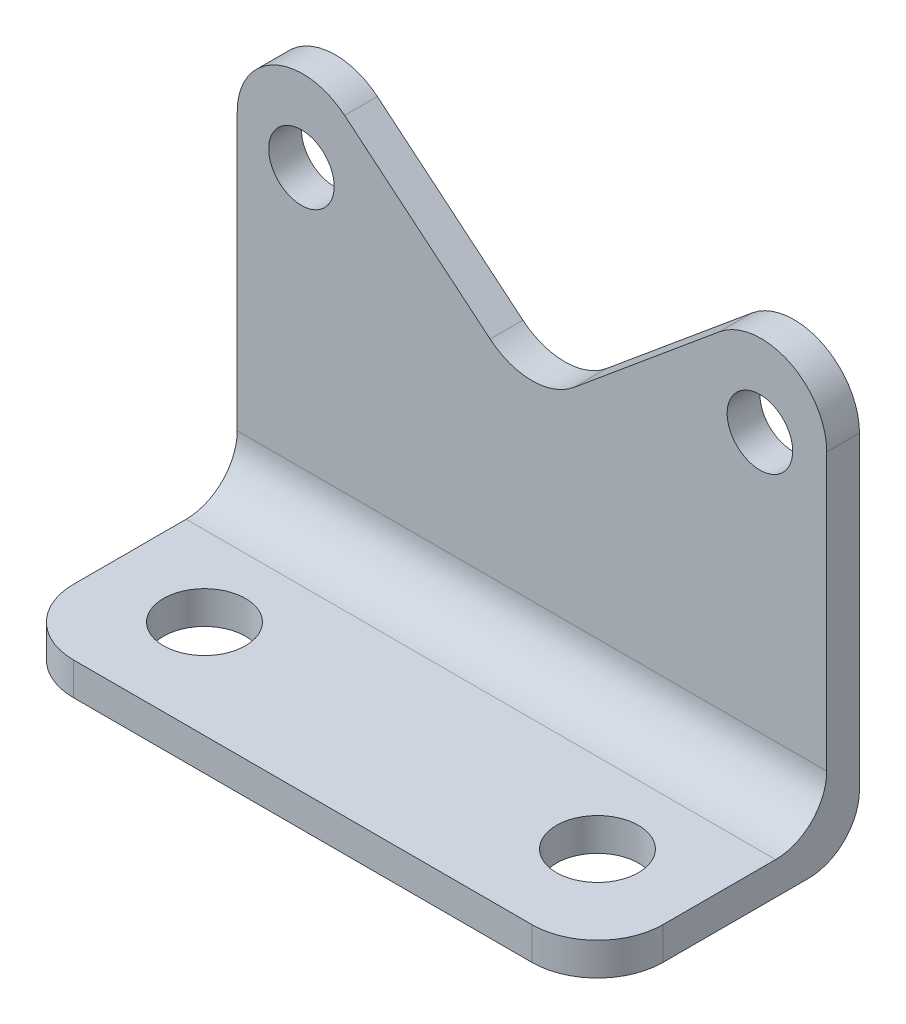
ISO-10303-21;
HEADER;
FILE_DESCRIPTION(('STEP AP214'),'2;1');
FILE_NAME('part.step','',(''),(''),'','','');
FILE_SCHEMA(('AUTOMOTIVE_DESIGN { 1 0 10303 214 1 1 1 1 }'));
ENDSEC;
DATA;
#1=APPLICATION_CONTEXT('core data for automotive mechanical design processes');
#2=APPLICATION_PROTOCOL_DEFINITION('international standard','automotive_design',2000,#1);
#3=PRODUCT_CONTEXT('',#1,'mechanical');
#4=PRODUCT('Part','Part','',(#3));
#5=PRODUCT_RELATED_PRODUCT_CATEGORY('part','',(#4));
#6=PRODUCT_DEFINITION_FORMATION('','',#4);
#7=PRODUCT_DEFINITION_CONTEXT('part definition',#1,'design');
#8=PRODUCT_DEFINITION('design','',#6,#7);
#9=PRODUCT_DEFINITION_SHAPE('','',#8);
#10=(LENGTH_UNIT() NAMED_UNIT(*) SI_UNIT(.MILLI.,.METRE.));
#11=(NAMED_UNIT(*) PLANE_ANGLE_UNIT() SI_UNIT($,.RADIAN.));
#12=(NAMED_UNIT(*) SI_UNIT($,.STERADIAN.) SOLID_ANGLE_UNIT());
#13=UNCERTAINTY_MEASURE_WITH_UNIT(LENGTH_MEASURE(1.E-05),#10,'distance_accuracy_value','');
#14=(GEOMETRIC_REPRESENTATION_CONTEXT(3) GLOBAL_UNCERTAINTY_ASSIGNED_CONTEXT((#13)) GLOBAL_UNIT_ASSIGNED_CONTEXT((#10,
#11,#12)) REPRESENTATION_CONTEXT('',''));
#15=CARTESIAN_POINT('',(0.,0.,0.));
#16=DIRECTION('',(0.,0.,1.));
#17=DIRECTION('',(1.,0.,0.));
#18=AXIS2_PLACEMENT_3D('',#15,#16,#17);
#19=CARTESIAN_POINT('',(0.,0.,3.175));
#20=DIRECTION('',(0.,0.,1.));
#21=DIRECTION('',(1.,0.,0.));
#22=AXIS2_PLACEMENT_3D('',#19,#20,#21);
#23=PLANE('',#22);
#24=CARTESIAN_POINT('',(-22.350267212,12.7,3.175));
#25=DIRECTION('',(0.,0.,1.));
#26=DIRECTION('',(1.,0.,0.));
#27=AXIS2_PLACEMENT_3D('',#24,#25,#26);
#28=CIRCLE('',#27,3.175);
#29=CARTESIAN_POINT('',(-19.175267212,12.7,3.175));
#30=VERTEX_POINT('',#29);
#31=EDGE_CURVE('E236',#30,#30,#28,.T.);
#32=ORIENTED_EDGE('',*,*,#31,.F.);
#33=EDGE_LOOP('',(#32));
#34=FACE_BOUND('',#33,.T.);
#35=CARTESIAN_POINT('',(22.099732788,12.7,3.175));
#36=DIRECTION('',(0.,0.,1.));
#37=DIRECTION('',(1.,0.,0.));
#38=AXIS2_PLACEMENT_3D('',#35,#36,#37);
#39=CIRCLE('',#38,3.175);
#40=CARTESIAN_POINT('',(25.274732788,12.7,3.175));
#41=VERTEX_POINT('',#40);
#42=EDGE_CURVE('E242',#41,#41,#39,.T.);
#43=ORIENTED_EDGE('',*,*,#42,.F.);
#44=EDGE_LOOP('',(#43));
#45=FACE_BOUND('',#44,.T.);
#46=CARTESIAN_POINT('',(-22.225,14.2875,3.175));
#47=DIRECTION('',(0.,0.,1.));
#48=DIRECTION('',(1.,0.,0.));
#49=AXIS2_PLACEMENT_3D('',#46,#47,#48);
#50=CIRCLE('',#49,6.35);
#51=CARTESIAN_POINT('',(-18.1666472309991,19.1713788685166,3.175));
#52=VERTEX_POINT('',#51);
#53=CARTESIAN_POINT('',(-28.575,14.2875,3.175));
#54=VERTEX_POINT('',#53);
#55=EDGE_CURVE('E271',#52,#54,#50,.T.);
#56=ORIENTED_EDGE('',*,*,#55,.T.);
#57=DIRECTION('',(0.,-1.,0.));
#58=VECTOR('',#57,1.);
#59=CARTESIAN_POINT('',(-28.575,20.6375,3.175));
#60=LINE('',#59,#58);
#61=CARTESIAN_POINT('',(-28.575,-12.5095,3.175));
#62=VERTEX_POINT('',#61);
#63=EDGE_CURVE('E187',#54,#62,#60,.T.);
#64=ORIENTED_EDGE('',*,*,#63,.T.);
#65=DIRECTION('',(-1.,0.,0.));
#66=VECTOR('',#65,1.);
#67=CARTESIAN_POINT('',(28.575,-12.5095,3.175));
#68=LINE('',#67,#66);
#69=CARTESIAN_POINT('',(28.575,-12.5095,3.175));
#70=VERTEX_POINT('',#69);
#71=EDGE_CURVE('E212',#62,#70,#68,.F.);
#72=ORIENTED_EDGE('',*,*,#71,.T.);
#73=DIRECTION('',(0.,1.,0.));
#74=VECTOR('',#73,1.);
#75=CARTESIAN_POINT('',(28.575,20.6375,3.175));
#76=LINE('',#75,#74);
#77=CARTESIAN_POINT('',(28.575,14.2875,3.175));
#78=VERTEX_POINT('',#77);
#79=EDGE_CURVE('E195',#70,#78,#76,.T.);
#80=ORIENTED_EDGE('',*,*,#79,.T.);
#81=CARTESIAN_POINT('',(22.225,14.2875,3.175));
#82=DIRECTION('',(0.,0.,1.));
#83=DIRECTION('',(1.,0.,0.));
#84=AXIS2_PLACEMENT_3D('',#81,#82,#83);
#85=CIRCLE('',#84,6.35);
#86=CARTESIAN_POINT('',(18.1666472309991,19.1713788685166,3.175));
#87=VERTEX_POINT('',#86);
#88=EDGE_CURVE('E493',#78,#87,#85,.T.);
#89=ORIENTED_EDGE('',*,*,#88,.T.);
#90=DIRECTION('',(0.769114782443556,0.639110672283604,0.));
#91=VECTOR('',#90,1.);
#92=CARTESIAN_POINT('',(-2.00328777681121,2.41078471922353,3.175));
#93=LINE('',#92,#91);
#94=CARTESIAN_POINT('',(4.05835276900088,7.4478211314834,3.175));
#95=VERTEX_POINT('',#94);
#96=EDGE_CURVE('E489',#95,#87,#93,.T.);
#97=ORIENTED_EDGE('',*,*,#96,.F.);
#98=CARTESIAN_POINT('',(0.,12.3317,3.175));
#99=DIRECTION('',(0.,0.,1.));
#100=DIRECTION('',(1.,0.,0.));
#101=AXIS2_PLACEMENT_3D('',#98,#99,#100);
#102=CIRCLE('',#101,6.35);
#103=CARTESIAN_POINT('',(-4.0583527690009,7.4478211314834,3.175));
#104=VERTEX_POINT('',#103);
#105=EDGE_CURVE('E483',#104,#95,#102,.T.);
#106=ORIENTED_EDGE('',*,*,#105,.F.);
#107=DIRECTION('',(0.769114782443556,-0.639110672283605,0.));
#108=VECTOR('',#107,1.);
#109=CARTESIAN_POINT('',(2.0032877768112,2.41078471922351,3.175));
#110=LINE('',#109,#108);
#111=EDGE_CURVE('E188',#52,#104,#110,.T.);
#112=ORIENTED_EDGE('',*,*,#111,.F.);
#113=EDGE_LOOP('',(#56,#64,#72,#80,#89,#97,#106,#112));
#114=FACE_BOUND('',#113,.T.);
#115=ADVANCED_FACE('F64',(#34,#45,#114),#23,.T.);
#116=CARTESIAN_POINT('',(0.,0.,0.));
#117=DIRECTION('',(0.,0.,1.));
#118=DIRECTION('',(1.,0.,0.));
#119=AXIS2_PLACEMENT_3D('',#116,#117,#118);
#120=PLANE('',#119);
#121=CARTESIAN_POINT('',(22.099732788,12.7,0.));
#122=DIRECTION('',(0.,0.,1.));
#123=DIRECTION('',(1.,0.,0.));
#124=AXIS2_PLACEMENT_3D('',#121,#122,#123);
#125=CIRCLE('',#124,3.175);
#126=CARTESIAN_POINT('',(25.274732788,12.7,0.));
#127=VERTEX_POINT('',#126);
#128=EDGE_CURVE('E234',#127,#127,#125,.T.);
#129=ORIENTED_EDGE('',*,*,#128,.T.);
#130=EDGE_LOOP('',(#129));
#131=FACE_BOUND('',#130,.T.);
#132=CARTESIAN_POINT('',(-22.350267212,12.7,0.));
#133=DIRECTION('',(0.,0.,1.));
#134=DIRECTION('',(1.,0.,0.));
#135=AXIS2_PLACEMENT_3D('',#132,#133,#134);
#136=CIRCLE('',#135,3.175);
#137=CARTESIAN_POINT('',(-19.175267212,12.7,0.));
#138=VERTEX_POINT('',#137);
#139=EDGE_CURVE('E68',#138,#138,#136,.T.);
#140=ORIENTED_EDGE('',*,*,#139,.T.);
#141=EDGE_LOOP('',(#140));
#142=FACE_BOUND('',#141,.T.);
#143=DIRECTION('',(0.,-1.,0.));
#144=VECTOR('',#143,1.);
#145=CARTESIAN_POINT('',(-28.575,20.6375,0.));
#146=LINE('',#145,#144);
#147=CARTESIAN_POINT('',(-28.575,14.2875,0.));
#148=VERTEX_POINT('',#147);
#149=CARTESIAN_POINT('',(-28.575,-15.6845,0.));
#150=VERTEX_POINT('',#149);
#151=EDGE_CURVE('E184',#148,#150,#146,.T.);
#152=ORIENTED_EDGE('',*,*,#151,.F.);
#153=CARTESIAN_POINT('',(-22.225,14.2875,0.));
#154=DIRECTION('',(0.,0.,1.));
#155=DIRECTION('',(1.,0.,0.));
#156=AXIS2_PLACEMENT_3D('',#153,#154,#155);
#157=CIRCLE('',#156,6.35);
#158=CARTESIAN_POINT('',(-18.1666472309991,19.1713788685166,0.));
#159=VERTEX_POINT('',#158);
#160=EDGE_CURVE('E168',#159,#148,#157,.T.);
#161=ORIENTED_EDGE('',*,*,#160,.F.);
#162=DIRECTION('',(0.769114782443556,-0.639110672283605,0.));
#163=VECTOR('',#162,1.);
#164=CARTESIAN_POINT('',(2.0032877768112,2.41078471922351,0.));
#165=LINE('',#164,#163);
#166=CARTESIAN_POINT('',(-4.0583527690009,7.4478211314834,0.));
#167=VERTEX_POINT('',#166);
#168=EDGE_CURVE('E499',#159,#167,#165,.T.);
#169=ORIENTED_EDGE('',*,*,#168,.T.);
#170=CARTESIAN_POINT('',(0.,12.3317,0.));
#171=DIRECTION('',(0.,0.,1.));
#172=DIRECTION('',(1.,0.,0.));
#173=AXIS2_PLACEMENT_3D('',#170,#171,#172);
#174=CIRCLE('',#173,6.35);
#175=CARTESIAN_POINT('',(4.05835276900088,7.4478211314834,0.));
#176=VERTEX_POINT('',#175);
#177=EDGE_CURVE('E522',#167,#176,#174,.T.);
#178=ORIENTED_EDGE('',*,*,#177,.T.);
#179=DIRECTION('',(0.769114782443556,0.639110672283604,0.));
#180=VECTOR('',#179,1.);
#181=CARTESIAN_POINT('',(-2.00328777681121,2.41078471922353,0.));
#182=LINE('',#181,#180);
#183=CARTESIAN_POINT('',(18.1666472309991,19.1713788685166,0.));
#184=VERTEX_POINT('',#183);
#185=EDGE_CURVE('E81',#176,#184,#182,.T.);
#186=ORIENTED_EDGE('',*,*,#185,.T.);
#187=CARTESIAN_POINT('',(22.225,14.2875,0.));
#188=DIRECTION('',(0.,0.,1.));
#189=DIRECTION('',(1.,0.,0.));
#190=AXIS2_PLACEMENT_3D('',#187,#188,#189);
#191=CIRCLE('',#190,6.35);
#192=CARTESIAN_POINT('',(28.575,14.2875,0.));
#193=VERTEX_POINT('',#192);
#194=EDGE_CURVE('E180',#193,#184,#191,.T.);
#195=ORIENTED_EDGE('',*,*,#194,.F.);
#196=DIRECTION('',(0.,1.,0.));
#197=VECTOR('',#196,1.);
#198=CARTESIAN_POINT('',(28.575,20.6375,0.));
#199=LINE('',#198,#197);
#200=CARTESIAN_POINT('',(28.575,-15.6845,0.));
#201=VERTEX_POINT('',#200);
#202=EDGE_CURVE('E196',#201,#193,#199,.T.);
#203=ORIENTED_EDGE('',*,*,#202,.F.);
#204=DIRECTION('',(-1.,0.,0.));
#205=VECTOR('',#204,1.);
#206=CARTESIAN_POINT('',(122.240863287072,-15.6845,0.));
#207=LINE('',#206,#205);
#208=EDGE_CURVE('E194',#201,#150,#207,.T.);
#209=ORIENTED_EDGE('',*,*,#208,.T.);
#210=EDGE_LOOP('',(#152,#161,#169,#178,#186,#195,#203,#209));
#211=FACE_BOUND('',#210,.T.);
#212=ADVANCED_FACE('F192',(#131,#142,#211),#120,.F.);
#213=CARTESIAN_POINT('',(-28.575,20.6375,3.175));
#214=DIRECTION('',(1.,0.,0.));
#215=DIRECTION('',(0.,1.,0.));
#216=AXIS2_PLACEMENT_3D('',#213,#214,#215);
#217=PLANE('',#216);
#218=DIRECTION('',(0.,0.,1.));
#219=VECTOR('',#218,1.);
#220=CARTESIAN_POINT('',(-28.575,14.2875,0.));
#221=LINE('',#220,#219);
#222=EDGE_CURVE('E172',#148,#54,#221,.T.);
#223=ORIENTED_EDGE('',*,*,#222,.F.);
#224=ORIENTED_EDGE('',*,*,#151,.T.);
#225=CARTESIAN_POINT('',(-28.575,-15.6845,4.953));
#226=DIRECTION('',(-1.,0.,0.));
#227=DIRECTION('',(0.,-1.,0.));
#228=AXIS2_PLACEMENT_3D('',#225,#226,#227);
#229=CIRCLE('',#228,4.953);
#230=CARTESIAN_POINT('',(-28.575,-20.6375,4.953));
#231=VERTEX_POINT('',#230);
#232=EDGE_CURVE('E252',#231,#150,#229,.F.);
#233=ORIENTED_EDGE('',*,*,#232,.F.);
#234=DIRECTION('',(0.,0.,-1.));
#235=VECTOR('',#234,1.);
#236=CARTESIAN_POINT('',(-28.575,-20.6375,3.175));
#237=LINE('',#236,#235);
#238=CARTESIAN_POINT('',(-28.575,-20.6375,19.05));
#239=VERTEX_POINT('',#238);
#240=EDGE_CURVE('E207',#239,#231,#237,.T.);
#241=ORIENTED_EDGE('',*,*,#240,.F.);
#242=DIRECTION('',(0.,-1.,0.));
#243=VECTOR('',#242,1.);
#244=CARTESIAN_POINT('',(-28.575,-17.4625,19.05));
#245=LINE('',#244,#243);
#246=CARTESIAN_POINT('',(-28.575,-17.4625,19.05));
#247=VERTEX_POINT('',#246);
#248=EDGE_CURVE('E73',#239,#247,#245,.F.);
#249=ORIENTED_EDGE('',*,*,#248,.T.);
#250=DIRECTION('',(0.,0.,1.));
#251=VECTOR('',#250,1.);
#252=CARTESIAN_POINT('',(-28.575,-17.4625,0.));
#253=LINE('',#252,#251);
#254=CARTESIAN_POINT('',(-28.575,-17.4625,8.128));
#255=VERTEX_POINT('',#254);
#256=EDGE_CURVE('E261',#255,#247,#253,.T.);
#257=ORIENTED_EDGE('',*,*,#256,.F.);
#258=CARTESIAN_POINT('',(-28.575,-12.5095,8.128));
#259=DIRECTION('',(1.,0.,0.));
#260=DIRECTION('',(0.,1.,0.));
#261=AXIS2_PLACEMENT_3D('',#258,#259,#260);
#262=CIRCLE('',#261,4.953);
#263=EDGE_CURVE('E214',#255,#62,#262,.T.);
#264=ORIENTED_EDGE('',*,*,#263,.T.);
#265=ORIENTED_EDGE('',*,*,#63,.F.);
#266=EDGE_LOOP('',(#223,#224,#233,#241,#249,#257,#264,#265));
#267=FACE_BOUND('',#266,.T.);
#268=ADVANCED_FACE('F182',(#267),#217,.F.);
#269=CARTESIAN_POINT('',(-28.575,-20.6375,3.175));
#270=DIRECTION('',(0.,1.,0.));
#271=DIRECTION('',(0.,0.,1.));
#272=AXIS2_PLACEMENT_3D('',#269,#270,#271);
#273=PLANE('',#272);
#274=CARTESIAN_POINT('',(-19.05,-20.6375,15.875));
#275=DIRECTION('',(0.,1.,0.));
#276=DIRECTION('',(0.,0.,1.));
#277=AXIS2_PLACEMENT_3D('',#274,#275,#276);
#278=CIRCLE('',#277,3.9751);
#279=CARTESIAN_POINT('',(-19.05,-20.6375,19.8501));
#280=VERTEX_POINT('',#279);
#281=EDGE_CURVE('E247',#280,#280,#278,.T.);
#282=ORIENTED_EDGE('',*,*,#281,.T.);
#283=EDGE_LOOP('',(#282));
#284=FACE_BOUND('',#283,.T.);
#285=CARTESIAN_POINT('',(19.05,-20.6375,15.875));
#286=DIRECTION('',(0.,1.,0.));
#287=DIRECTION('',(0.,0.,1.));
#288=AXIS2_PLACEMENT_3D('',#285,#286,#287);
#289=CIRCLE('',#288,3.9751);
#290=CARTESIAN_POINT('',(19.05,-20.6375,19.8501));
#291=VERTEX_POINT('',#290);
#292=EDGE_CURVE('E509',#291,#291,#289,.T.);
#293=ORIENTED_EDGE('',*,*,#292,.T.);
#294=EDGE_LOOP('',(#293));
#295=FACE_BOUND('',#294,.T.);
#296=DIRECTION('',(1.,0.,0.));
#297=VECTOR('',#296,1.);
#298=CARTESIAN_POINT('',(-28.575,-20.6375,25.4));
#299=LINE('',#298,#297);
#300=CARTESIAN_POINT('',(-22.225,-20.6375,25.4));
#301=VERTEX_POINT('',#300);
#302=CARTESIAN_POINT('',(22.225,-20.6375,25.4));
#303=VERTEX_POINT('',#302);
#304=EDGE_CURVE('E201',#301,#303,#299,.T.);
#305=ORIENTED_EDGE('',*,*,#304,.F.);
#306=CARTESIAN_POINT('',(-22.225,-20.6375,19.05));
#307=DIRECTION('',(0.,1.,0.));
#308=DIRECTION('',(0.,0.,1.));
#309=AXIS2_PLACEMENT_3D('',#306,#307,#308);
#310=CIRCLE('',#309,6.35);
#311=EDGE_CURVE('E232',#301,#239,#310,.F.);
#312=ORIENTED_EDGE('',*,*,#311,.T.);
#313=ORIENTED_EDGE('',*,*,#240,.T.);
#314=DIRECTION('',(-1.,0.,0.));
#315=VECTOR('',#314,1.);
#316=CARTESIAN_POINT('',(122.240863287072,-20.6375,4.953));
#317=LINE('',#316,#315);
#318=CARTESIAN_POINT('',(28.575,-20.6375,4.953));
#319=VERTEX_POINT('',#318);
#320=EDGE_CURVE('E254',#319,#231,#317,.T.);
#321=ORIENTED_EDGE('',*,*,#320,.F.);
#322=DIRECTION('',(0.,0.,-1.));
#323=VECTOR('',#322,1.);
#324=CARTESIAN_POINT('',(28.575,-20.6375,3.175));
#325=LINE('',#324,#323);
#326=CARTESIAN_POINT('',(28.575,-20.6375,19.05));
#327=VERTEX_POINT('',#326);
#328=EDGE_CURVE('E205',#327,#319,#325,.T.);
#329=ORIENTED_EDGE('',*,*,#328,.F.);
#330=CARTESIAN_POINT('',(22.225,-20.6375,19.05));
#331=DIRECTION('',(0.,1.,0.));
#332=DIRECTION('',(0.,0.,1.));
#333=AXIS2_PLACEMENT_3D('',#330,#331,#332);
#334=CIRCLE('',#333,6.35);
#335=EDGE_CURVE('E221',#327,#303,#334,.F.);
#336=ORIENTED_EDGE('',*,*,#335,.T.);
#337=EDGE_LOOP('',(#305,#312,#313,#321,#329,#336));
#338=FACE_BOUND('',#337,.T.);
#339=ADVANCED_FACE('F293',(#284,#295,#338),#273,.F.);
#340=CARTESIAN_POINT('',(28.575,20.6375,3.175));
#341=DIRECTION('',(-1.,0.,0.));
#342=DIRECTION('',(0.,-1.,0.));
#343=AXIS2_PLACEMENT_3D('',#340,#341,#342);
#344=PLANE('',#343);
#345=ORIENTED_EDGE('',*,*,#202,.T.);
#346=DIRECTION('',(0.,0.,1.));
#347=VECTOR('',#346,1.);
#348=CARTESIAN_POINT('',(28.575,14.2875,0.));
#349=LINE('',#348,#347);
#350=EDGE_CURVE('E189',#193,#78,#349,.T.);
#351=ORIENTED_EDGE('',*,*,#350,.T.);
#352=ORIENTED_EDGE('',*,*,#79,.F.);
#353=CARTESIAN_POINT('',(28.575,-12.5095,8.128));
#354=DIRECTION('',(-1.,0.,0.));
#355=DIRECTION('',(0.,-1.,0.));
#356=AXIS2_PLACEMENT_3D('',#353,#354,#355);
#357=CIRCLE('',#356,4.953);
#358=CARTESIAN_POINT('',(28.575,-17.4625,8.128));
#359=VERTEX_POINT('',#358);
#360=EDGE_CURVE('E216',#70,#359,#357,.T.);
#361=ORIENTED_EDGE('',*,*,#360,.T.);
#362=DIRECTION('',(0.,0.,1.));
#363=VECTOR('',#362,1.);
#364=CARTESIAN_POINT('',(28.575,-17.4625,0.));
#365=LINE('',#364,#363);
#366=CARTESIAN_POINT('',(28.575,-17.4625,19.05));
#367=VERTEX_POINT('',#366);
#368=EDGE_CURVE('E260',#359,#367,#365,.T.);
#369=ORIENTED_EDGE('',*,*,#368,.T.);
#370=DIRECTION('',(0.,-1.,0.));
#371=VECTOR('',#370,1.);
#372=CARTESIAN_POINT('',(28.575,-20.6375,19.05));
#373=LINE('',#372,#371);
#374=EDGE_CURVE('E218',#367,#327,#373,.T.);
#375=ORIENTED_EDGE('',*,*,#374,.T.);
#376=ORIENTED_EDGE('',*,*,#328,.T.);
#377=CARTESIAN_POINT('',(28.575,-15.6845,4.953));
#378=DIRECTION('',(-1.,0.,0.));
#379=DIRECTION('',(0.,-1.,0.));
#380=AXIS2_PLACEMENT_3D('',#377,#378,#379);
#381=CIRCLE('',#380,4.953);
#382=EDGE_CURVE('E240',#319,#201,#381,.F.);
#383=ORIENTED_EDGE('',*,*,#382,.T.);
#384=EDGE_LOOP('',(#345,#351,#352,#361,#369,#375,#376,#383));
#385=FACE_BOUND('',#384,.T.);
#386=ADVANCED_FACE('F278',(#385),#344,.F.);
#387=CARTESIAN_POINT('',(-28.575,-17.4625,25.4));
#388=DIRECTION('',(0.,0.,1.));
#389=DIRECTION('',(1.,0.,0.));
#390=AXIS2_PLACEMENT_3D('',#387,#388,#389);
#391=PLANE('',#390);
#392=DIRECTION('',(1.,0.,0.));
#393=VECTOR('',#392,1.);
#394=CARTESIAN_POINT('',(-28.575,-17.4625,25.4));
#395=LINE('',#394,#393);
#396=CARTESIAN_POINT('',(-22.225,-17.4625,25.4));
#397=VERTEX_POINT('',#396);
#398=CARTESIAN_POINT('',(22.225,-17.4625,25.4));
#399=VERTEX_POINT('',#398);
#400=EDGE_CURVE('E263',#397,#399,#395,.T.);
#401=ORIENTED_EDGE('',*,*,#400,.F.);
#402=DIRECTION('',(0.,-1.,0.));
#403=VECTOR('',#402,1.);
#404=CARTESIAN_POINT('',(-22.225,-20.6375,25.4));
#405=LINE('',#404,#403);
#406=EDGE_CURVE('E229',#397,#301,#405,.T.);
#407=ORIENTED_EDGE('',*,*,#406,.T.);
#408=ORIENTED_EDGE('',*,*,#304,.T.);
#409=DIRECTION('',(0.,-1.,0.));
#410=VECTOR('',#409,1.);
#411=CARTESIAN_POINT('',(22.225,-17.4625,25.4));
#412=LINE('',#411,#410);
#413=EDGE_CURVE('E224',#303,#399,#412,.F.);
#414=ORIENTED_EDGE('',*,*,#413,.T.);
#415=EDGE_LOOP('',(#401,#407,#408,#414));
#416=FACE_BOUND('',#415,.T.);
#417=ADVANCED_FACE('F300',(#416),#391,.T.);
#418=CARTESIAN_POINT('',(-28.575,-17.4625,0.));
#419=DIRECTION('',(0.,1.,0.));
#420=DIRECTION('',(0.,0.,1.));
#421=AXIS2_PLACEMENT_3D('',#418,#419,#420);
#422=PLANE('',#421);
#423=CARTESIAN_POINT('',(-19.05,-17.4625,15.875));
#424=DIRECTION('',(0.,1.,0.));
#425=DIRECTION('',(0.,0.,1.));
#426=AXIS2_PLACEMENT_3D('',#423,#424,#425);
#427=CIRCLE('',#426,3.9751);
#428=CARTESIAN_POINT('',(-19.05,-17.4625,19.8501));
#429=VERTEX_POINT('',#428);
#430=EDGE_CURVE('E506',#429,#429,#427,.T.);
#431=ORIENTED_EDGE('',*,*,#430,.F.);
#432=EDGE_LOOP('',(#431));
#433=FACE_BOUND('',#432,.T.);
#434=CARTESIAN_POINT('',(19.05,-17.4625,15.875));
#435=DIRECTION('',(0.,1.,0.));
#436=DIRECTION('',(0.,0.,1.));
#437=AXIS2_PLACEMENT_3D('',#434,#435,#436);
#438=CIRCLE('',#437,3.9751);
#439=CARTESIAN_POINT('',(19.05,-17.4625,19.8501));
#440=VERTEX_POINT('',#439);
#441=EDGE_CURVE('E501',#440,#440,#438,.T.);
#442=ORIENTED_EDGE('',*,*,#441,.F.);
#443=EDGE_LOOP('',(#442));
#444=FACE_BOUND('',#443,.T.);
#445=ORIENTED_EDGE('',*,*,#256,.T.);
#446=CARTESIAN_POINT('',(-22.225,-17.4625,19.05));
#447=DIRECTION('',(0.,1.,0.));
#448=DIRECTION('',(0.,0.,1.));
#449=AXIS2_PLACEMENT_3D('',#446,#447,#448);
#450=CIRCLE('',#449,6.35);
#451=EDGE_CURVE('E12',#247,#397,#450,.T.);
#452=ORIENTED_EDGE('',*,*,#451,.T.);
#453=ORIENTED_EDGE('',*,*,#400,.T.);
#454=CARTESIAN_POINT('',(22.225,-17.4625,19.05));
#455=DIRECTION('',(0.,1.,0.));
#456=DIRECTION('',(0.,0.,1.));
#457=AXIS2_PLACEMENT_3D('',#454,#455,#456);
#458=CIRCLE('',#457,6.35);
#459=EDGE_CURVE('E227',#399,#367,#458,.T.);
#460=ORIENTED_EDGE('',*,*,#459,.T.);
#461=ORIENTED_EDGE('',*,*,#368,.F.);
#462=DIRECTION('',(-1.,0.,0.));
#463=VECTOR('',#462,1.);
#464=CARTESIAN_POINT('',(-28.575,-17.4625,8.128));
#465=LINE('',#464,#463);
#466=EDGE_CURVE('E209',#359,#255,#465,.T.);
#467=ORIENTED_EDGE('',*,*,#466,.T.);
#468=EDGE_LOOP('',(#445,#452,#453,#460,#461,#467));
#469=FACE_BOUND('',#468,.T.);
#470=ADVANCED_FACE('F282',(#433,#444,#469),#422,.T.);
#471=CARTESIAN_POINT('',(122.240863287072,-15.6845,4.953));
#472=DIRECTION('',(-1.,0.,0.));
#473=DIRECTION('',(0.,-1.,0.));
#474=AXIS2_PLACEMENT_3D('',#471,#472,#473);
#475=CYLINDRICAL_SURFACE('',#474,4.953);
#476=ORIENTED_EDGE('',*,*,#382,.F.);
#477=ORIENTED_EDGE('',*,*,#320,.T.);
#478=ORIENTED_EDGE('',*,*,#232,.T.);
#479=ORIENTED_EDGE('',*,*,#208,.F.);
#480=EDGE_LOOP('',(#476,#477,#478,#479));
#481=FACE_BOUND('',#480,.T.);
#482=ADVANCED_FACE('F295',(#481),#475,.T.);
#483=CARTESIAN_POINT('',(-28.575,-12.5095,8.128));
#484=DIRECTION('',(1.,0.,0.));
#485=DIRECTION('',(0.,1.,0.));
#486=AXIS2_PLACEMENT_3D('',#483,#484,#485);
#487=CYLINDRICAL_SURFACE('',#486,4.953);
#488=ORIENTED_EDGE('',*,*,#360,.F.);
#489=ORIENTED_EDGE('',*,*,#71,.F.);
#490=ORIENTED_EDGE('',*,*,#263,.F.);
#491=ORIENTED_EDGE('',*,*,#466,.F.);
#492=EDGE_LOOP('',(#488,#489,#490,#491));
#493=FACE_BOUND('',#492,.T.);
#494=ADVANCED_FACE('F275',(#493),#487,.F.);
#495=CARTESIAN_POINT('',(22.225,20.6375,19.05));
#496=DIRECTION('',(0.,1.,0.));
#497=DIRECTION('',(-1.,0.,0.));
#498=AXIS2_PLACEMENT_3D('',#495,#496,#497);
#499=CYLINDRICAL_SURFACE('',#498,6.35);
#500=ORIENTED_EDGE('',*,*,#459,.F.);
#501=ORIENTED_EDGE('',*,*,#413,.F.);
#502=ORIENTED_EDGE('',*,*,#335,.F.);
#503=ORIENTED_EDGE('',*,*,#374,.F.);
#504=EDGE_LOOP('',(#500,#501,#502,#503));
#505=FACE_BOUND('',#504,.T.);
#506=ADVANCED_FACE('F287',(#505),#499,.T.);
#507=CARTESIAN_POINT('',(-22.225,-17.4625,19.05));
#508=DIRECTION('',(0.,1.,0.));
#509=DIRECTION('',(-1.,0.,0.));
#510=AXIS2_PLACEMENT_3D('',#507,#508,#509);
#511=CYLINDRICAL_SURFACE('',#510,6.35);
#512=ORIENTED_EDGE('',*,*,#451,.F.);
#513=ORIENTED_EDGE('',*,*,#248,.F.);
#514=ORIENTED_EDGE('',*,*,#311,.F.);
#515=ORIENTED_EDGE('',*,*,#406,.F.);
#516=EDGE_LOOP('',(#512,#513,#514,#515));
#517=FACE_BOUND('',#516,.T.);
#518=ADVANCED_FACE('F66',(#517),#511,.T.);
#519=CARTESIAN_POINT('',(22.099732788,12.7,-53.975));
#520=DIRECTION('',(0.,0.,1.));
#521=DIRECTION('',(1.,0.,0.));
#522=AXIS2_PLACEMENT_3D('',#519,#520,#521);
#523=CYLINDRICAL_SURFACE('',#522,3.175);
#524=ORIENTED_EDGE('',*,*,#42,.T.);
#525=EDGE_LOOP('',(#524));
#526=FACE_BOUND('',#525,.T.);
#527=ORIENTED_EDGE('',*,*,#128,.F.);
#528=EDGE_LOOP('',(#527));
#529=FACE_BOUND('',#528,.T.);
#530=ADVANCED_FACE('F330',(#526,#529),#523,.F.);
#531=CARTESIAN_POINT('',(-22.350267212,12.7,-53.975));
#532=DIRECTION('',(0.,0.,1.));
#533=DIRECTION('',(1.,0.,0.));
#534=AXIS2_PLACEMENT_3D('',#531,#532,#533);
#535=CYLINDRICAL_SURFACE('',#534,3.175);
#536=ORIENTED_EDGE('',*,*,#31,.T.);
#537=EDGE_LOOP('',(#536));
#538=FACE_BOUND('',#537,.T.);
#539=ORIENTED_EDGE('',*,*,#139,.F.);
#540=EDGE_LOOP('',(#539));
#541=FACE_BOUND('',#540,.T.);
#542=ADVANCED_FACE('F334',(#538,#541),#535,.F.);
#543=CARTESIAN_POINT('',(19.05,-74.6125,15.875));
#544=DIRECTION('',(0.,1.,0.));
#545=DIRECTION('',(0.,0.,1.));
#546=AXIS2_PLACEMENT_3D('',#543,#544,#545);
#547=CYLINDRICAL_SURFACE('',#546,3.9751);
#548=ORIENTED_EDGE('',*,*,#441,.T.);
#549=EDGE_LOOP('',(#548));
#550=FACE_BOUND('',#549,.T.);
#551=ORIENTED_EDGE('',*,*,#292,.F.);
#552=EDGE_LOOP('',(#551));
#553=FACE_BOUND('',#552,.T.);
#554=ADVANCED_FACE('F340',(#550,#553),#547,.F.);
#555=CARTESIAN_POINT('',(-19.05,-74.6125,15.875));
#556=DIRECTION('',(0.,1.,0.));
#557=DIRECTION('',(0.,0.,1.));
#558=AXIS2_PLACEMENT_3D('',#555,#556,#557);
#559=CYLINDRICAL_SURFACE('',#558,3.9751);
#560=ORIENTED_EDGE('',*,*,#430,.T.);
#561=EDGE_LOOP('',(#560));
#562=FACE_BOUND('',#561,.T.);
#563=ORIENTED_EDGE('',*,*,#281,.F.);
#564=EDGE_LOOP('',(#563));
#565=FACE_BOUND('',#564,.T.);
#566=ADVANCED_FACE('F396',(#562,#565),#559,.F.);
#567=CARTESIAN_POINT('',(2.0032877768112,2.41078471922351,0.));
#568=DIRECTION('',(-0.639110672283605,-0.769114782443556,0.));
#569=DIRECTION('',(0.769114782443556,-0.639110672283605,0.));
#570=AXIS2_PLACEMENT_3D('',#567,#568,#569);
#571=PLANE('',#570);
#572=ORIENTED_EDGE('',*,*,#111,.T.);
#573=DIRECTION('',(0.,0.,1.));
#574=VECTOR('',#573,1.);
#575=CARTESIAN_POINT('',(-4.0583527690009,7.4478211314834,0.));
#576=LINE('',#575,#574);
#577=EDGE_CURVE('E179',#167,#104,#576,.T.);
#578=ORIENTED_EDGE('',*,*,#577,.F.);
#579=ORIENTED_EDGE('',*,*,#168,.F.);
#580=DIRECTION('',(0.,0.,1.));
#581=VECTOR('',#580,1.);
#582=CARTESIAN_POINT('',(-18.1666472309991,19.1713788685166,0.));
#583=LINE('',#582,#581);
#584=EDGE_CURVE('E174',#159,#52,#583,.T.);
#585=ORIENTED_EDGE('',*,*,#584,.T.);
#586=EDGE_LOOP('',(#572,#578,#579,#585));
#587=FACE_BOUND('',#586,.T.);
#588=ADVANCED_FACE('F404',(#587),#571,.F.);
#589=CARTESIAN_POINT('',(-22.225,14.2875,0.));
#590=DIRECTION('',(0.,0.,1.));
#591=DIRECTION('',(1.,0.,0.));
#592=AXIS2_PLACEMENT_3D('',#589,#590,#591);
#593=CYLINDRICAL_SURFACE('',#592,6.35);
#594=ORIENTED_EDGE('',*,*,#55,.F.);
#595=ORIENTED_EDGE('',*,*,#584,.F.);
#596=ORIENTED_EDGE('',*,*,#160,.T.);
#597=ORIENTED_EDGE('',*,*,#222,.T.);
#598=EDGE_LOOP('',(#594,#595,#596,#597));
#599=FACE_BOUND('',#598,.T.);
#600=ADVANCED_FACE('F171',(#599),#593,.T.);
#601=CARTESIAN_POINT('',(22.225,14.2875,0.));
#602=DIRECTION('',(0.,0.,1.));
#603=DIRECTION('',(1.,0.,0.));
#604=AXIS2_PLACEMENT_3D('',#601,#602,#603);
#605=CYLINDRICAL_SURFACE('',#604,6.35);
#606=ORIENTED_EDGE('',*,*,#88,.F.);
#607=ORIENTED_EDGE('',*,*,#350,.F.);
#608=ORIENTED_EDGE('',*,*,#194,.T.);
#609=DIRECTION('',(0.,0.,1.));
#610=VECTOR('',#609,1.);
#611=CARTESIAN_POINT('',(18.1666472309991,19.1713788685166,0.));
#612=LINE('',#611,#610);
#613=EDGE_CURVE('E502',#184,#87,#612,.T.);
#614=ORIENTED_EDGE('',*,*,#613,.T.);
#615=EDGE_LOOP('',(#606,#607,#608,#614));
#616=FACE_BOUND('',#615,.T.);
#617=ADVANCED_FACE('F448',(#616),#605,.T.);
#618=CARTESIAN_POINT('',(-2.00328777681121,2.41078471922353,0.));
#619=DIRECTION('',(0.639110672283604,-0.769114782443556,0.));
#620=DIRECTION('',(0.769114782443556,0.639110672283604,0.));
#621=AXIS2_PLACEMENT_3D('',#618,#619,#620);
#622=PLANE('',#621);
#623=ORIENTED_EDGE('',*,*,#96,.T.);
#624=ORIENTED_EDGE('',*,*,#613,.F.);
#625=ORIENTED_EDGE('',*,*,#185,.F.);
#626=DIRECTION('',(0.,0.,1.));
#627=VECTOR('',#626,1.);
#628=CARTESIAN_POINT('',(4.05835276900088,7.4478211314834,0.));
#629=LINE('',#628,#627);
#630=EDGE_CURVE('E486',#176,#95,#629,.T.);
#631=ORIENTED_EDGE('',*,*,#630,.T.);
#632=EDGE_LOOP('',(#623,#624,#625,#631));
#633=FACE_BOUND('',#632,.T.);
#634=ADVANCED_FACE('F458',(#633),#622,.F.);
#635=CARTESIAN_POINT('',(0.,12.3317,0.));
#636=DIRECTION('',(0.,0.,1.));
#637=DIRECTION('',(1.,0.,0.));
#638=AXIS2_PLACEMENT_3D('',#635,#636,#637);
#639=CYLINDRICAL_SURFACE('',#638,6.35);
#640=ORIENTED_EDGE('',*,*,#105,.T.);
#641=ORIENTED_EDGE('',*,*,#630,.F.);
#642=ORIENTED_EDGE('',*,*,#177,.F.);
#643=ORIENTED_EDGE('',*,*,#577,.T.);
#644=EDGE_LOOP('',(#640,#641,#642,#643));
#645=FACE_BOUND('',#644,.T.);
#646=ADVANCED_FACE('F468',(#645),#639,.F.);
#647=CLOSED_SHELL('',(#115,#212,#268,#339,#386,#417,#470,#482,#494,#506,#518,#530,#542,#554,
#566,#588,#600,#617,#634,#646));
#648=MANIFOLD_SOLID_BREP('B2',#647);
#649=ADVANCED_BREP_SHAPE_REPRESENTATION('',(#18,#648),#14);
#650=SHAPE_DEFINITION_REPRESENTATION(#9,#649);
ENDSEC;
END-ISO-10303-21;
